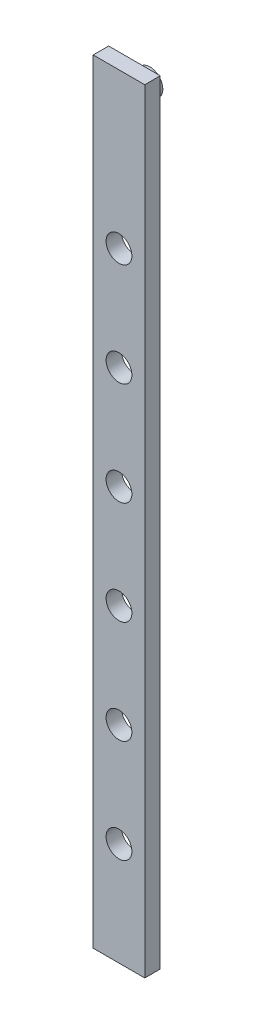
ISO-10303-21;
HEADER;
FILE_DESCRIPTION(('STEP AP214'),'2;1');
FILE_NAME('part.step','',(''),(''),'','','');
FILE_SCHEMA(('AUTOMOTIVE_DESIGN { 1 0 10303 214 1 1 1 1 }'));
ENDSEC;
DATA;
#1=APPLICATION_CONTEXT('core data for automotive mechanical design processes');
#2=APPLICATION_PROTOCOL_DEFINITION('international standard','automotive_design',2000,#1);
#3=PRODUCT_CONTEXT('',#1,'mechanical');
#4=PRODUCT('Part','Part','',(#3));
#5=PRODUCT_RELATED_PRODUCT_CATEGORY('part','',(#4));
#6=PRODUCT_DEFINITION_FORMATION('','',#4);
#7=PRODUCT_DEFINITION_CONTEXT('part definition',#1,'design');
#8=PRODUCT_DEFINITION('design','',#6,#7);
#9=PRODUCT_DEFINITION_SHAPE('','',#8);
#10=(LENGTH_UNIT() NAMED_UNIT(*) SI_UNIT(.MILLI.,.METRE.));
#11=(NAMED_UNIT(*) PLANE_ANGLE_UNIT() SI_UNIT($,.RADIAN.));
#12=(NAMED_UNIT(*) SI_UNIT($,.STERADIAN.) SOLID_ANGLE_UNIT());
#13=UNCERTAINTY_MEASURE_WITH_UNIT(LENGTH_MEASURE(1.E-05),#10,'distance_accuracy_value','');
#14=(GEOMETRIC_REPRESENTATION_CONTEXT(3) GLOBAL_UNCERTAINTY_ASSIGNED_CONTEXT((#13)) GLOBAL_UNIT_ASSIGNED_CONTEXT((#10,
#11,#12)) REPRESENTATION_CONTEXT('',''));
#15=CARTESIAN_POINT('',(0.,0.,0.));
#16=DIRECTION('',(0.,0.,1.));
#17=DIRECTION('',(1.,0.,0.));
#18=AXIS2_PLACEMENT_3D('',#15,#16,#17);
#19=CARTESIAN_POINT('',(0.,0.,3.));
#20=DIRECTION('',(0.,0.,-1.));
#21=DIRECTION('',(-1.,0.,0.));
#22=AXIS2_PLACEMENT_3D('',#19,#20,#21);
#23=PLANE('',#22);
#24=DIRECTION('',(0.,1.,0.));
#25=VECTOR('',#24,1.);
#26=CARTESIAN_POINT('',(4.99999999999995,-75.,3.));
#27=LINE('',#26,#25);
#28=CARTESIAN_POINT('',(4.99999999999995,-75.,3.));
#29=VERTEX_POINT('',#28);
#30=CARTESIAN_POINT('',(5.00000000000005,75.,3.));
#31=VERTEX_POINT('',#30);
#32=EDGE_CURVE('E86',#29,#31,#27,.T.);
#33=ORIENTED_EDGE('',*,*,#32,.T.);
#34=DIRECTION('',(-1.,0.,0.));
#35=VECTOR('',#34,1.);
#36=CARTESIAN_POINT('',(-4.99999999999995,75.,3.));
#37=LINE('',#36,#35);
#38=CARTESIAN_POINT('',(-4.99999999999995,75.,3.));
#39=VERTEX_POINT('',#38);
#40=EDGE_CURVE('E81',#31,#39,#37,.T.);
#41=ORIENTED_EDGE('',*,*,#40,.T.);
#42=DIRECTION('',(0.,-1.,0.));
#43=VECTOR('',#42,1.);
#44=CARTESIAN_POINT('',(-4.99999999999995,-75.,3.));
#45=LINE('',#44,#43);
#46=CARTESIAN_POINT('',(-4.99999999999995,-75.,3.));
#47=VERTEX_POINT('',#46);
#48=EDGE_CURVE('E84',#39,#47,#45,.T.);
#49=ORIENTED_EDGE('',*,*,#48,.T.);
#50=DIRECTION('',(1.,0.,0.));
#51=VECTOR('',#50,1.);
#52=CARTESIAN_POINT('',(-4.99999999999995,-75.,3.));
#53=LINE('',#52,#51);
#54=EDGE_CURVE('E50',#47,#29,#53,.T.);
#55=ORIENTED_EDGE('',*,*,#54,.T.);
#56=EDGE_LOOP('',(#33,#41,#49,#55));
#57=FACE_BOUND('',#56,.T.);
#58=CARTESIAN_POINT('',(0.,-55.,3.));
#59=DIRECTION('',(0.,0.,1.));
#60=DIRECTION('',(1.,0.,0.));
#61=AXIS2_PLACEMENT_3D('',#58,#59,#60);
#62=CIRCLE('',#61,2.5);
#63=CARTESIAN_POINT('',(2.5,-55.,3.));
#64=VERTEX_POINT('',#63);
#65=EDGE_CURVE('E103',#64,#64,#62,.T.);
#66=ORIENTED_EDGE('',*,*,#65,.F.);
#67=EDGE_LOOP('',(#66));
#68=FACE_BOUND('',#67,.T.);
#69=CARTESIAN_POINT('',(0.,-35.,3.));
#70=DIRECTION('',(0.,0.,1.));
#71=DIRECTION('',(1.,0.,0.));
#72=AXIS2_PLACEMENT_3D('',#69,#70,#71);
#73=CIRCLE('',#72,2.5);
#74=CARTESIAN_POINT('',(2.5,-35.,3.));
#75=VERTEX_POINT('',#74);
#76=EDGE_CURVE('E152',#75,#75,#73,.T.);
#77=ORIENTED_EDGE('',*,*,#76,.F.);
#78=EDGE_LOOP('',(#77));
#79=FACE_BOUND('',#78,.T.);
#80=CARTESIAN_POINT('',(0.,-15.,3.));
#81=DIRECTION('',(0.,0.,1.));
#82=DIRECTION('',(1.,0.,0.));
#83=AXIS2_PLACEMENT_3D('',#80,#81,#82);
#84=CIRCLE('',#83,2.5);
#85=CARTESIAN_POINT('',(2.5,-15.,3.));
#86=VERTEX_POINT('',#85);
#87=EDGE_CURVE('E147',#86,#86,#84,.T.);
#88=ORIENTED_EDGE('',*,*,#87,.F.);
#89=EDGE_LOOP('',(#88));
#90=FACE_BOUND('',#89,.T.);
#91=CARTESIAN_POINT('',(0.,5.00000000000004,3.));
#92=DIRECTION('',(0.,0.,1.));
#93=DIRECTION('',(1.,0.,0.));
#94=AXIS2_PLACEMENT_3D('',#91,#92,#93);
#95=CIRCLE('',#94,2.5);
#96=CARTESIAN_POINT('',(2.5,5.00000000000004,3.));
#97=VERTEX_POINT('',#96);
#98=EDGE_CURVE('E142',#97,#97,#95,.T.);
#99=ORIENTED_EDGE('',*,*,#98,.F.);
#100=EDGE_LOOP('',(#99));
#101=FACE_BOUND('',#100,.T.);
#102=CARTESIAN_POINT('',(0.,25.,3.));
#103=DIRECTION('',(0.,0.,1.));
#104=DIRECTION('',(1.,0.,0.));
#105=AXIS2_PLACEMENT_3D('',#102,#103,#104);
#106=CIRCLE('',#105,2.5);
#107=CARTESIAN_POINT('',(2.5,25.,3.));
#108=VERTEX_POINT('',#107);
#109=EDGE_CURVE('E137',#108,#108,#106,.T.);
#110=ORIENTED_EDGE('',*,*,#109,.F.);
#111=EDGE_LOOP('',(#110));
#112=FACE_BOUND('',#111,.T.);
#113=CARTESIAN_POINT('',(0.,45.,3.));
#114=DIRECTION('',(0.,0.,1.));
#115=DIRECTION('',(1.,0.,0.));
#116=AXIS2_PLACEMENT_3D('',#113,#114,#115);
#117=CIRCLE('',#116,2.5);
#118=CARTESIAN_POINT('',(2.5,45.,3.));
#119=VERTEX_POINT('',#118);
#120=EDGE_CURVE('E128',#119,#119,#117,.T.);
#121=ORIENTED_EDGE('',*,*,#120,.F.);
#122=EDGE_LOOP('',(#121));
#123=FACE_BOUND('',#122,.T.);
#124=ADVANCED_FACE('F33',(#57,#68,#79,#90,#101,#112,#123),#23,.F.);
#125=CARTESIAN_POINT('',(0.,0.,0.));
#126=DIRECTION('',(0.,0.,-1.));
#127=DIRECTION('',(-1.,0.,0.));
#128=AXIS2_PLACEMENT_3D('',#125,#126,#127);
#129=PLANE('',#128);
#130=CARTESIAN_POINT('',(0.,70.,0.));
#131=DIRECTION('',(0.,0.,-1.));
#132=DIRECTION('',(-1.,0.,0.));
#133=AXIS2_PLACEMENT_3D('',#130,#131,#132);
#134=CIRCLE('',#133,2.5);
#135=CARTESIAN_POINT('',(-2.5,70.,0.));
#136=VERTEX_POINT('',#135);
#137=EDGE_CURVE('E11',#136,#136,#134,.T.);
#138=ORIENTED_EDGE('',*,*,#137,.F.);
#139=EDGE_LOOP('',(#138));
#140=FACE_BOUND('',#139,.T.);
#141=CARTESIAN_POINT('',(0.,25.,0.));
#142=DIRECTION('',(0.,0.,1.));
#143=DIRECTION('',(1.,0.,0.));
#144=AXIS2_PLACEMENT_3D('',#141,#142,#143);
#145=CIRCLE('',#144,2.5);
#146=CARTESIAN_POINT('',(2.5,25.,0.));
#147=VERTEX_POINT('',#146);
#148=EDGE_CURVE('E132',#147,#147,#145,.T.);
#149=ORIENTED_EDGE('',*,*,#148,.T.);
#150=EDGE_LOOP('',(#149));
#151=FACE_BOUND('',#150,.T.);
#152=CARTESIAN_POINT('',(0.,-15.,0.));
#153=DIRECTION('',(0.,0.,1.));
#154=DIRECTION('',(1.,0.,0.));
#155=AXIS2_PLACEMENT_3D('',#152,#153,#154);
#156=CIRCLE('',#155,2.5);
#157=CARTESIAN_POINT('',(2.5,-15.,0.));
#158=VERTEX_POINT('',#157);
#159=EDGE_CURVE('E145',#158,#158,#156,.T.);
#160=ORIENTED_EDGE('',*,*,#159,.T.);
#161=EDGE_LOOP('',(#160));
#162=FACE_BOUND('',#161,.T.);
#163=CARTESIAN_POINT('',(0.,-55.,0.));
#164=DIRECTION('',(0.,0.,1.));
#165=DIRECTION('',(1.,0.,0.));
#166=AXIS2_PLACEMENT_3D('',#163,#164,#165);
#167=CIRCLE('',#166,2.5);
#168=CARTESIAN_POINT('',(2.5,-55.,0.));
#169=VERTEX_POINT('',#168);
#170=EDGE_CURVE('E155',#169,#169,#167,.T.);
#171=ORIENTED_EDGE('',*,*,#170,.T.);
#172=EDGE_LOOP('',(#171));
#173=FACE_BOUND('',#172,.T.);
#174=DIRECTION('',(0.,1.,0.));
#175=VECTOR('',#174,1.);
#176=CARTESIAN_POINT('',(4.99999999999995,-75.,0.));
#177=LINE('',#176,#175);
#178=CARTESIAN_POINT('',(4.99999999999995,-75.,0.));
#179=VERTEX_POINT('',#178);
#180=CARTESIAN_POINT('',(5.00000000000005,75.,0.));
#181=VERTEX_POINT('',#180);
#182=EDGE_CURVE('E100',#179,#181,#177,.T.);
#183=ORIENTED_EDGE('',*,*,#182,.F.);
#184=DIRECTION('',(1.,0.,0.));
#185=VECTOR('',#184,1.);
#186=CARTESIAN_POINT('',(-4.99999999999995,-75.,0.));
#187=LINE('',#186,#185);
#188=CARTESIAN_POINT('',(-4.99999999999995,-75.,0.));
#189=VERTEX_POINT('',#188);
#190=EDGE_CURVE('E73',#189,#179,#187,.T.);
#191=ORIENTED_EDGE('',*,*,#190,.F.);
#192=DIRECTION('',(0.,-1.,0.));
#193=VECTOR('',#192,1.);
#194=CARTESIAN_POINT('',(-4.99999999999995,-75.,0.));
#195=LINE('',#194,#193);
#196=CARTESIAN_POINT('',(-4.99999999999995,75.,0.));
#197=VERTEX_POINT('',#196);
#198=EDGE_CURVE('E67',#197,#189,#195,.T.);
#199=ORIENTED_EDGE('',*,*,#198,.F.);
#200=DIRECTION('',(-1.,0.,0.));
#201=VECTOR('',#200,1.);
#202=CARTESIAN_POINT('',(-4.99999999999995,75.,0.));
#203=LINE('',#202,#201);
#204=EDGE_CURVE('E91',#181,#197,#203,.T.);
#205=ORIENTED_EDGE('',*,*,#204,.F.);
#206=EDGE_LOOP('',(#183,#191,#199,#205));
#207=FACE_BOUND('',#206,.T.);
#208=CARTESIAN_POINT('',(0.,-35.,0.));
#209=DIRECTION('',(0.,0.,1.));
#210=DIRECTION('',(1.,0.,0.));
#211=AXIS2_PLACEMENT_3D('',#208,#209,#210);
#212=CIRCLE('',#211,2.5);
#213=CARTESIAN_POINT('',(2.5,-35.,0.));
#214=VERTEX_POINT('',#213);
#215=EDGE_CURVE('E119',#214,#214,#212,.T.);
#216=ORIENTED_EDGE('',*,*,#215,.T.);
#217=EDGE_LOOP('',(#216));
#218=FACE_BOUND('',#217,.T.);
#219=CARTESIAN_POINT('',(0.,5.00000000000004,0.));
#220=DIRECTION('',(0.,0.,1.));
#221=DIRECTION('',(1.,0.,0.));
#222=AXIS2_PLACEMENT_3D('',#219,#220,#221);
#223=CIRCLE('',#222,2.5);
#224=CARTESIAN_POINT('',(2.5,5.00000000000004,0.));
#225=VERTEX_POINT('',#224);
#226=EDGE_CURVE('E123',#225,#225,#223,.T.);
#227=ORIENTED_EDGE('',*,*,#226,.T.);
#228=EDGE_LOOP('',(#227));
#229=FACE_BOUND('',#228,.T.);
#230=CARTESIAN_POINT('',(0.,45.,0.));
#231=DIRECTION('',(0.,0.,1.));
#232=DIRECTION('',(1.,0.,0.));
#233=AXIS2_PLACEMENT_3D('',#230,#231,#232);
#234=CIRCLE('',#233,2.5);
#235=CARTESIAN_POINT('',(2.5,45.,0.));
#236=VERTEX_POINT('',#235);
#237=EDGE_CURVE('E126',#236,#236,#234,.T.);
#238=ORIENTED_EDGE('',*,*,#237,.T.);
#239=EDGE_LOOP('',(#238));
#240=FACE_BOUND('',#239,.T.);
#241=ADVANCED_FACE('F111',(#140,#151,#162,#173,#207,#218,#229,#240),#129,.T.);
#242=CARTESIAN_POINT('',(4.99999999999995,-75.,3.));
#243=DIRECTION('',(-1.,0.,0.));
#244=DIRECTION('',(0.,-1.,0.));
#245=AXIS2_PLACEMENT_3D('',#242,#243,#244);
#246=PLANE('',#245);
#247=ORIENTED_EDGE('',*,*,#182,.T.);
#248=DIRECTION('',(0.,0.,-1.));
#249=VECTOR('',#248,1.);
#250=CARTESIAN_POINT('',(5.00000000000005,75.,3.));
#251=LINE('',#250,#249);
#252=EDGE_CURVE('E42',#31,#181,#251,.T.);
#253=ORIENTED_EDGE('',*,*,#252,.F.);
#254=ORIENTED_EDGE('',*,*,#32,.F.);
#255=DIRECTION('',(0.,0.,-1.));
#256=VECTOR('',#255,1.);
#257=CARTESIAN_POINT('',(4.99999999999995,-75.,3.));
#258=LINE('',#257,#256);
#259=EDGE_CURVE('E96',#29,#179,#258,.T.);
#260=ORIENTED_EDGE('',*,*,#259,.T.);
#261=EDGE_LOOP('',(#247,#253,#254,#260));
#262=FACE_BOUND('',#261,.T.);
#263=ADVANCED_FACE('F35',(#262),#246,.F.);
#264=CARTESIAN_POINT('',(-4.99999999999995,75.,3.));
#265=DIRECTION('',(0.,-1.,0.));
#266=DIRECTION('',(0.,0.,-1.));
#267=AXIS2_PLACEMENT_3D('',#264,#265,#266);
#268=PLANE('',#267);
#269=ORIENTED_EDGE('',*,*,#204,.T.);
#270=DIRECTION('',(0.,0.,-1.));
#271=VECTOR('',#270,1.);
#272=CARTESIAN_POINT('',(-4.99999999999995,75.,3.));
#273=LINE('',#272,#271);
#274=EDGE_CURVE('E89',#39,#197,#273,.T.);
#275=ORIENTED_EDGE('',*,*,#274,.F.);
#276=ORIENTED_EDGE('',*,*,#40,.F.);
#277=ORIENTED_EDGE('',*,*,#252,.T.);
#278=EDGE_LOOP('',(#269,#275,#276,#277));
#279=FACE_BOUND('',#278,.T.);
#280=ADVANCED_FACE('F90',(#279),#268,.F.);
#281=CARTESIAN_POINT('',(-4.99999999999995,-75.,3.));
#282=DIRECTION('',(1.,0.,0.));
#283=DIRECTION('',(0.,0.,-1.));
#284=AXIS2_PLACEMENT_3D('',#281,#282,#283);
#285=PLANE('',#284);
#286=ORIENTED_EDGE('',*,*,#198,.T.);
#287=DIRECTION('',(0.,0.,-1.));
#288=VECTOR('',#287,1.);
#289=CARTESIAN_POINT('',(-4.99999999999995,-75.,3.));
#290=LINE('',#289,#288);
#291=EDGE_CURVE('E92',#47,#189,#290,.T.);
#292=ORIENTED_EDGE('',*,*,#291,.F.);
#293=ORIENTED_EDGE('',*,*,#48,.F.);
#294=ORIENTED_EDGE('',*,*,#274,.T.);
#295=EDGE_LOOP('',(#286,#292,#293,#294));
#296=FACE_BOUND('',#295,.T.);
#297=ADVANCED_FACE('F94',(#296),#285,.F.);
#298=CARTESIAN_POINT('',(-4.99999999999995,-75.,3.));
#299=DIRECTION('',(0.,1.,0.));
#300=DIRECTION('',(0.,0.,1.));
#301=AXIS2_PLACEMENT_3D('',#298,#299,#300);
#302=PLANE('',#301);
#303=ORIENTED_EDGE('',*,*,#190,.T.);
#304=ORIENTED_EDGE('',*,*,#259,.F.);
#305=ORIENTED_EDGE('',*,*,#54,.F.);
#306=ORIENTED_EDGE('',*,*,#291,.T.);
#307=EDGE_LOOP('',(#303,#304,#305,#306));
#308=FACE_BOUND('',#307,.T.);
#309=ADVANCED_FACE('F166',(#308),#302,.F.);
#310=CARTESIAN_POINT('',(0.,-55.,3.));
#311=DIRECTION('',(0.,0.,-1.));
#312=DIRECTION('',(-1.,0.,0.));
#313=AXIS2_PLACEMENT_3D('',#310,#311,#312);
#314=CYLINDRICAL_SURFACE('',#313,2.5);
#315=ORIENTED_EDGE('',*,*,#65,.T.);
#316=EDGE_LOOP('',(#315));
#317=FACE_BOUND('',#316,.T.);
#318=ORIENTED_EDGE('',*,*,#170,.F.);
#319=EDGE_LOOP('',(#318));
#320=FACE_BOUND('',#319,.T.);
#321=ADVANCED_FACE('F163',(#317,#320),#314,.F.);
#322=CARTESIAN_POINT('',(0.,-35.,3.));
#323=DIRECTION('',(0.,0.,-1.));
#324=DIRECTION('',(-1.,0.,0.));
#325=AXIS2_PLACEMENT_3D('',#322,#323,#324);
#326=CYLINDRICAL_SURFACE('',#325,2.5);
#327=ORIENTED_EDGE('',*,*,#76,.T.);
#328=EDGE_LOOP('',(#327));
#329=FACE_BOUND('',#328,.T.);
#330=ORIENTED_EDGE('',*,*,#215,.F.);
#331=EDGE_LOOP('',(#330));
#332=FACE_BOUND('',#331,.T.);
#333=ADVANCED_FACE('F165',(#329,#332),#326,.F.);
#334=CARTESIAN_POINT('',(0.,-15.,3.));
#335=DIRECTION('',(0.,0.,-1.));
#336=DIRECTION('',(-1.,0.,0.));
#337=AXIS2_PLACEMENT_3D('',#334,#335,#336);
#338=CYLINDRICAL_SURFACE('',#337,2.5);
#339=ORIENTED_EDGE('',*,*,#87,.T.);
#340=EDGE_LOOP('',(#339));
#341=FACE_BOUND('',#340,.T.);
#342=ORIENTED_EDGE('',*,*,#159,.F.);
#343=EDGE_LOOP('',(#342));
#344=FACE_BOUND('',#343,.T.);
#345=ADVANCED_FACE('F173',(#341,#344),#338,.F.);
#346=CARTESIAN_POINT('',(0.,5.00000000000004,3.));
#347=DIRECTION('',(0.,0.,-1.));
#348=DIRECTION('',(-1.,0.,0.));
#349=AXIS2_PLACEMENT_3D('',#346,#347,#348);
#350=CYLINDRICAL_SURFACE('',#349,2.5);
#351=ORIENTED_EDGE('',*,*,#98,.T.);
#352=EDGE_LOOP('',(#351));
#353=FACE_BOUND('',#352,.T.);
#354=ORIENTED_EDGE('',*,*,#226,.F.);
#355=EDGE_LOOP('',(#354));
#356=FACE_BOUND('',#355,.T.);
#357=ADVANCED_FACE('F230',(#353,#356),#350,.F.);
#358=CARTESIAN_POINT('',(0.,25.,3.));
#359=DIRECTION('',(0.,0.,-1.));
#360=DIRECTION('',(-1.,0.,0.));
#361=AXIS2_PLACEMENT_3D('',#358,#359,#360);
#362=CYLINDRICAL_SURFACE('',#361,2.5);
#363=ORIENTED_EDGE('',*,*,#109,.T.);
#364=EDGE_LOOP('',(#363));
#365=FACE_BOUND('',#364,.T.);
#366=ORIENTED_EDGE('',*,*,#148,.F.);
#367=EDGE_LOOP('',(#366));
#368=FACE_BOUND('',#367,.T.);
#369=ADVANCED_FACE('F226',(#365,#368),#362,.F.);
#370=CARTESIAN_POINT('',(0.,45.,3.));
#371=DIRECTION('',(0.,0.,-1.));
#372=DIRECTION('',(-1.,0.,0.));
#373=AXIS2_PLACEMENT_3D('',#370,#371,#372);
#374=CYLINDRICAL_SURFACE('',#373,2.5);
#375=ORIENTED_EDGE('',*,*,#120,.T.);
#376=EDGE_LOOP('',(#375));
#377=FACE_BOUND('',#376,.T.);
#378=ORIENTED_EDGE('',*,*,#237,.F.);
#379=EDGE_LOOP('',(#378));
#380=FACE_BOUND('',#379,.T.);
#381=ADVANCED_FACE('F207',(#377,#380),#374,.F.);
#382=CARTESIAN_POINT('',(0.,70.,-3.));
#383=DIRECTION('',(0.,0.,1.));
#384=DIRECTION('',(1.,0.,0.));
#385=AXIS2_PLACEMENT_3D('',#382,#383,#384);
#386=CYLINDRICAL_SURFACE('',#385,2.5);
#387=ORIENTED_EDGE('',*,*,#137,.T.);
#388=EDGE_LOOP('',(#387));
#389=FACE_BOUND('',#388,.T.);
#390=CARTESIAN_POINT('',(0.,70.,-3.));
#391=DIRECTION('',(0.,0.,1.));
#392=DIRECTION('',(1.,0.,0.));
#393=AXIS2_PLACEMENT_3D('',#390,#391,#392);
#394=CIRCLE('',#393,2.5);
#395=CARTESIAN_POINT('',(2.5,70.,-3.));
#396=VERTEX_POINT('',#395);
#397=EDGE_CURVE('E129',#396,#396,#394,.T.);
#398=ORIENTED_EDGE('',*,*,#397,.T.);
#399=EDGE_LOOP('',(#398));
#400=FACE_BOUND('',#399,.T.);
#401=ADVANCED_FACE('F201',(#389,#400),#386,.T.);
#402=CARTESIAN_POINT('',(0.,70.,-3.));
#403=DIRECTION('',(0.,0.,1.));
#404=DIRECTION('',(1.,0.,0.));
#405=AXIS2_PLACEMENT_3D('',#402,#403,#404);
#406=PLANE('',#405);
#407=ORIENTED_EDGE('',*,*,#397,.F.);
#408=EDGE_LOOP('',(#407));
#409=FACE_BOUND('',#408,.T.);
#410=ADVANCED_FACE('F206',(#409),#406,.F.);
#411=CLOSED_SHELL('',(#124,#241,#263,#280,#297,#309,#321,#333,#345,#357,#369,#381,#401,#410));
#412=MANIFOLD_SOLID_BREP('B2',#411);
#413=ADVANCED_BREP_SHAPE_REPRESENTATION('',(#18,#412),#14);
#414=SHAPE_DEFINITION_REPRESENTATION(#9,#413);
ENDSEC;
END-ISO-10303-21;
